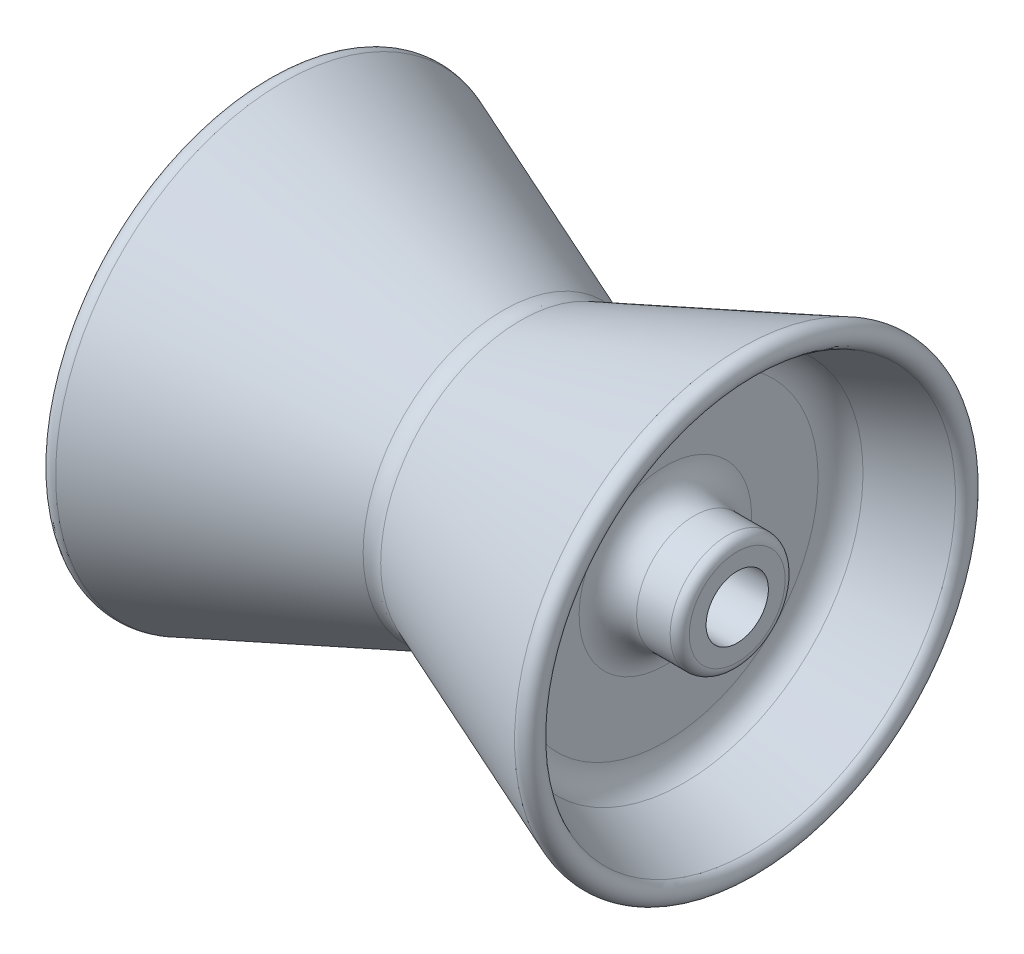
ISO-10303-21;
HEADER;
FILE_DESCRIPTION(('STEP AP214'),'2;1');
FILE_NAME('part.step','',(''),(''),'','','');
FILE_SCHEMA(('AUTOMOTIVE_DESIGN { 1 0 10303 214 1 1 1 1 }'));
ENDSEC;
DATA;
#1=APPLICATION_CONTEXT('core data for automotive mechanical design processes');
#2=APPLICATION_PROTOCOL_DEFINITION('international standard','automotive_design',2000,#1);
#3=PRODUCT_CONTEXT('',#1,'mechanical');
#4=PRODUCT('Part','Part','',(#3));
#5=PRODUCT_RELATED_PRODUCT_CATEGORY('part','',(#4));
#6=PRODUCT_DEFINITION_FORMATION('','',#4);
#7=PRODUCT_DEFINITION_CONTEXT('part definition',#1,'design');
#8=PRODUCT_DEFINITION('design','',#6,#7);
#9=PRODUCT_DEFINITION_SHAPE('','',#8);
#10=(LENGTH_UNIT() NAMED_UNIT(*) SI_UNIT(.MILLI.,.METRE.));
#11=(NAMED_UNIT(*) PLANE_ANGLE_UNIT() SI_UNIT($,.RADIAN.));
#12=(NAMED_UNIT(*) SI_UNIT($,.STERADIAN.) SOLID_ANGLE_UNIT());
#13=UNCERTAINTY_MEASURE_WITH_UNIT(LENGTH_MEASURE(1.E-05),#10,'distance_accuracy_value','');
#14=(GEOMETRIC_REPRESENTATION_CONTEXT(3) GLOBAL_UNCERTAINTY_ASSIGNED_CONTEXT((#13)) GLOBAL_UNIT_ASSIGNED_CONTEXT((#10,
#11,#12)) REPRESENTATION_CONTEXT('',''));
#15=CARTESIAN_POINT('',(0.,0.,0.));
#16=DIRECTION('',(0.,0.,1.));
#17=DIRECTION('',(1.,0.,0.));
#18=AXIS2_PLACEMENT_3D('',#15,#16,#17);
#19=CARTESIAN_POINT('',(239.439905947278,0.,0.));
#20=DIRECTION('',(1.,0.,0.));
#21=DIRECTION('',(0.,1.,0.));
#22=AXIS2_PLACEMENT_3D('',#19,#20,#21);
#23=CONICAL_SURFACE('',#22,236.773734056667,0.374812801640397);
#24=CARTESIAN_POINT('',(9.152458329224,0.,0.));
#25=DIRECTION('',(-1.,0.,0.));
#26=DIRECTION('',(0.,-1.,0.));
#27=AXIS2_PLACEMENT_3D('',#24,#25,#26);
#28=CIRCLE('',#27,146.176259793207);
#29=CARTESIAN_POINT('',(9.152458329224,-146.176259793207,0.));
#30=VERTEX_POINT('',#29);
#31=EDGE_CURVE('E124',#30,#30,#28,.T.);
#32=ORIENTED_EDGE('',*,*,#31,.F.);
#33=EDGE_LOOP('',(#32));
#34=FACE_BOUND('',#33,.T.);
#35=CARTESIAN_POINT('',(239.439905947278,0.,0.));
#36=DIRECTION('',(-1.,0.,0.));
#37=DIRECTION('',(0.,-1.,0.));
#38=AXIS2_PLACEMENT_3D('',#35,#36,#37);
#39=CIRCLE('',#38,236.773734056667);
#40=CARTESIAN_POINT('',(239.439905947278,-236.773734056667,0.));
#41=VERTEX_POINT('',#40);
#42=EDGE_CURVE('E121',#41,#41,#39,.T.);
#43=ORIENTED_EDGE('',*,*,#42,.T.);
#44=EDGE_LOOP('',(#43));
#45=FACE_BOUND('',#44,.T.);
#46=ADVANCED_FACE('F35',(#34,#45),#23,.T.);
#47=CARTESIAN_POINT('',(1.71737624121704E-13,0.,0.));
#48=DIRECTION('',(-1.,0.,0.));
#49=DIRECTION('',(0.,-1.,0.));
#50=AXIS2_PLACEMENT_3D('',#47,#48,#49);
#51=TOROIDAL_SURFACE('',#50,169.440664073821,25.000000000001);
#52=ORIENTED_EDGE('',*,*,#31,.T.);
#53=EDGE_LOOP('',(#52));
#54=FACE_BOUND('',#53,.T.);
#55=CARTESIAN_POINT('',(-9.15245832922424,0.,0.));
#56=DIRECTION('',(-1.,0.,0.));
#57=DIRECTION('',(0.,-1.,0.));
#58=AXIS2_PLACEMENT_3D('',#55,#56,#57);
#59=CIRCLE('',#58,146.176259793206);
#60=CARTESIAN_POINT('',(-9.15245832922424,-146.176259793206,0.));
#61=VERTEX_POINT('',#60);
#62=EDGE_CURVE('E10',#61,#61,#59,.T.);
#63=ORIENTED_EDGE('',*,*,#62,.F.);
#64=EDGE_LOOP('',(#63));
#65=FACE_BOUND('',#64,.T.);
#66=ADVANCED_FACE('F37',(#54,#65),#51,.F.);
#67=CARTESIAN_POINT('',(243.833085945306,0.,0.));
#68=DIRECTION('',(-1.,0.,0.));
#69=DIRECTION('',(0.,-1.,0.));
#70=AXIS2_PLACEMENT_3D('',#67,#68,#69);
#71=TOROIDAL_SURFACE('',#70,225.606820001973,12.);
#72=ORIENTED_EDGE('',*,*,#42,.F.);
#73=EDGE_LOOP('',(#72));
#74=FACE_BOUND('',#73,.T.);
#75=CARTESIAN_POINT('',(248.226265943333,0.,0.));
#76=DIRECTION('',(-1.,0.,0.));
#77=DIRECTION('',(0.,-1.,0.));
#78=AXIS2_PLACEMENT_3D('',#75,#76,#77);
#79=CIRCLE('',#78,214.439905947278);
#80=CARTESIAN_POINT('',(248.226265943333,-214.439905947278,0.));
#81=VERTEX_POINT('',#80);
#82=EDGE_CURVE('E118',#81,#81,#79,.T.);
#83=ORIENTED_EDGE('',*,*,#82,.T.);
#84=EDGE_LOOP('',(#83));
#85=FACE_BOUND('',#84,.T.);
#86=ADVANCED_FACE('F133',(#74,#85),#71,.T.);
#87=CARTESIAN_POINT('',(248.226265943333,0.,0.));
#88=DIRECTION('',(1.,0.,0.));
#89=DIRECTION('',(0.,1.,0.));
#90=AXIS2_PLACEMENT_3D('',#87,#88,#89);
#91=CONICAL_SURFACE('',#90,214.439905947278,0.374812801640398);
#92=CARTESIAN_POINT('',(179.017050004931,0.,0.));
#93=DIRECTION('',(-1.,0.,0.));
#94=DIRECTION('',(0.,-1.,0.));
#95=AXIS2_PLACEMENT_3D('',#92,#93,#94);
#96=CIRCLE('',#95,187.212281408345);
#97=CARTESIAN_POINT('',(179.017050004931,-187.212281408345,0.));
#98=VERTEX_POINT('',#97);
#99=EDGE_CURVE('E115',#98,#98,#96,.T.);
#100=ORIENTED_EDGE('',*,*,#99,.T.);
#101=EDGE_LOOP('',(#100));
#102=FACE_BOUND('',#101,.T.);
#103=ORIENTED_EDGE('',*,*,#82,.F.);
#104=EDGE_LOOP('',(#103));
#105=FACE_BOUND('',#104,.T.);
#106=ADVANCED_FACE('F138',(#102,#105),#91,.F.);
#107=CARTESIAN_POINT('',(190.,0.,0.));
#108=DIRECTION('',(-1.,0.,0.));
#109=DIRECTION('',(0.,-1.,0.));
#110=AXIS2_PLACEMENT_3D('',#107,#108,#109);
#111=TOROIDAL_SURFACE('',#110,159.294996271609,30.);
#112=CARTESIAN_POINT('',(160.,0.,0.));
#113=DIRECTION('',(-1.,0.,0.));
#114=DIRECTION('',(0.,-1.,0.));
#115=AXIS2_PLACEMENT_3D('',#112,#113,#114);
#116=CIRCLE('',#115,159.294996271609);
#117=CARTESIAN_POINT('',(160.,-159.294996271609,0.));
#118=VERTEX_POINT('',#117);
#119=EDGE_CURVE('E112',#118,#118,#116,.T.);
#120=ORIENTED_EDGE('',*,*,#119,.T.);
#121=EDGE_LOOP('',(#120));
#122=FACE_BOUND('',#121,.T.);
#123=ORIENTED_EDGE('',*,*,#99,.F.);
#124=EDGE_LOOP('',(#123));
#125=FACE_BOUND('',#124,.T.);
#126=ADVANCED_FACE('F143',(#122,#125),#111,.F.);
#127=CARTESIAN_POINT('',(160.,0.,0.));
#128=DIRECTION('',(-1.,0.,0.));
#129=DIRECTION('',(0.,-1.,0.));
#130=AXIS2_PLACEMENT_3D('',#127,#128,#129);
#131=PLANE('',#130);
#132=ORIENTED_EDGE('',*,*,#119,.F.);
#133=EDGE_LOOP('',(#132));
#134=FACE_BOUND('',#133,.T.);
#135=CARTESIAN_POINT('',(160.,0.,0.));
#136=DIRECTION('',(-1.,0.,0.));
#137=DIRECTION('',(0.,-1.,0.));
#138=AXIS2_PLACEMENT_3D('',#135,#136,#137);
#139=CIRCLE('',#138,90.);
#140=CARTESIAN_POINT('',(160.,-90.,0.));
#141=VERTEX_POINT('',#140);
#142=EDGE_CURVE('E109',#141,#141,#139,.T.);
#143=ORIENTED_EDGE('',*,*,#142,.T.);
#144=EDGE_LOOP('',(#143));
#145=FACE_BOUND('',#144,.T.);
#146=ADVANCED_FACE('F149',(#134,#145),#131,.F.);
#147=CARTESIAN_POINT('',(190.,0.,0.));
#148=DIRECTION('',(-1.,0.,0.));
#149=DIRECTION('',(0.,-1.,0.));
#150=AXIS2_PLACEMENT_3D('',#147,#148,#149);
#151=TOROIDAL_SURFACE('',#150,90.,30.);
#152=CARTESIAN_POINT('',(190.,0.,0.));
#153=DIRECTION('',(-1.,0.,0.));
#154=DIRECTION('',(0.,-1.,0.));
#155=AXIS2_PLACEMENT_3D('',#152,#153,#154);
#156=CIRCLE('',#155,60.);
#157=CARTESIAN_POINT('',(190.,-60.,0.));
#158=VERTEX_POINT('',#157);
#159=EDGE_CURVE('E106',#158,#158,#156,.T.);
#160=ORIENTED_EDGE('',*,*,#159,.T.);
#161=EDGE_LOOP('',(#160));
#162=FACE_BOUND('',#161,.T.);
#163=ORIENTED_EDGE('',*,*,#142,.F.);
#164=EDGE_LOOP('',(#163));
#165=FACE_BOUND('',#164,.T.);
#166=ADVANCED_FACE('F184',(#162,#165),#151,.F.);
#167=CARTESIAN_POINT('',(-0.0308439148893081,0.,0.));
#168=DIRECTION('',(-1.,0.,0.));
#169=DIRECTION('',(0.,-1.,0.));
#170=AXIS2_PLACEMENT_3D('',#167,#168,#169);
#171=CYLINDRICAL_SURFACE('',#170,60.);
#172=CARTESIAN_POINT('',(225.,0.,0.));
#173=DIRECTION('',(-1.,0.,0.));
#174=DIRECTION('',(0.,-1.,0.));
#175=AXIS2_PLACEMENT_3D('',#172,#173,#174);
#176=CIRCLE('',#175,60.);
#177=CARTESIAN_POINT('',(225.,-60.,0.));
#178=VERTEX_POINT('',#177);
#179=EDGE_CURVE('E103',#178,#178,#176,.T.);
#180=ORIENTED_EDGE('',*,*,#179,.T.);
#181=EDGE_LOOP('',(#180));
#182=FACE_BOUND('',#181,.T.);
#183=ORIENTED_EDGE('',*,*,#159,.F.);
#184=EDGE_LOOP('',(#183));
#185=FACE_BOUND('',#184,.T.);
#186=ADVANCED_FACE('F195',(#182,#185),#171,.T.);
#187=CARTESIAN_POINT('',(225.,0.,0.));
#188=DIRECTION('',(-1.,0.,0.));
#189=DIRECTION('',(0.,-1.,0.));
#190=AXIS2_PLACEMENT_3D('',#187,#188,#189);
#191=TOROIDAL_SURFACE('',#190,50.,10.);
#192=CARTESIAN_POINT('',(235.,0.,0.));
#193=DIRECTION('',(-1.,0.,0.));
#194=DIRECTION('',(0.,-1.,0.));
#195=AXIS2_PLACEMENT_3D('',#192,#193,#194);
#196=CIRCLE('',#195,49.9999999999999);
#197=CARTESIAN_POINT('',(235.,-49.9999999999999,0.));
#198=VERTEX_POINT('',#197);
#199=EDGE_CURVE('E100',#198,#198,#196,.T.);
#200=ORIENTED_EDGE('',*,*,#199,.T.);
#201=EDGE_LOOP('',(#200));
#202=FACE_BOUND('',#201,.T.);
#203=ORIENTED_EDGE('',*,*,#179,.F.);
#204=EDGE_LOOP('',(#203));
#205=FACE_BOUND('',#204,.T.);
#206=ADVANCED_FACE('F206',(#202,#205),#191,.T.);
#207=CARTESIAN_POINT('',(235.,3.72717729695589E-13,0.));
#208=DIRECTION('',(1.,0.,0.));
#209=DIRECTION('',(0.,1.,0.));
#210=AXIS2_PLACEMENT_3D('',#207,#208,#209);
#211=PLANE('',#210);
#212=CARTESIAN_POINT('',(235.,0.,0.));
#213=DIRECTION('',(-1.,0.,0.));
#214=DIRECTION('',(0.,-1.,0.));
#215=AXIS2_PLACEMENT_3D('',#212,#213,#214);
#216=CIRCLE('',#215,32.5);
#217=CARTESIAN_POINT('',(235.,-32.5,0.));
#218=VERTEX_POINT('',#217);
#219=EDGE_CURVE('E97',#218,#218,#216,.T.);
#220=ORIENTED_EDGE('',*,*,#219,.T.);
#221=EDGE_LOOP('',(#220));
#222=FACE_BOUND('',#221,.T.);
#223=ORIENTED_EDGE('',*,*,#199,.F.);
#224=EDGE_LOOP('',(#223));
#225=FACE_BOUND('',#224,.T.);
#226=ADVANCED_FACE('F217',(#222,#225),#211,.T.);
#227=CARTESIAN_POINT('',(-0.0308439148893081,0.,0.));
#228=DIRECTION('',(-1.,0.,0.));
#229=DIRECTION('',(0.,-1.,0.));
#230=AXIS2_PLACEMENT_3D('',#227,#228,#229);
#231=CYLINDRICAL_SURFACE('',#230,32.5);
#232=ORIENTED_EDGE('',*,*,#219,.F.);
#233=EDGE_LOOP('',(#232));
#234=FACE_BOUND('',#233,.T.);
#235=CARTESIAN_POINT('',(130.,0.,0.));
#236=DIRECTION('',(-1.,0.,0.));
#237=DIRECTION('',(0.,-1.,0.));
#238=AXIS2_PLACEMENT_3D('',#235,#236,#237);
#239=CIRCLE('',#238,32.5);
#240=CARTESIAN_POINT('',(130.,-32.5,0.));
#241=VERTEX_POINT('',#240);
#242=EDGE_CURVE('E94',#241,#241,#239,.T.);
#243=ORIENTED_EDGE('',*,*,#242,.T.);
#244=EDGE_LOOP('',(#243));
#245=FACE_BOUND('',#244,.T.);
#246=ADVANCED_FACE('F228',(#234,#245),#231,.F.);
#247=CARTESIAN_POINT('',(130.,0.,0.));
#248=DIRECTION('',(1.,0.,0.));
#249=DIRECTION('',(0.,1.,0.));
#250=AXIS2_PLACEMENT_3D('',#247,#248,#249);
#251=PLANE('',#250);
#252=ORIENTED_EDGE('',*,*,#242,.F.);
#253=EDGE_LOOP('',(#252));
#254=FACE_BOUND('',#253,.T.);
#255=CARTESIAN_POINT('',(130.,0.,0.));
#256=DIRECTION('',(-1.,0.,0.));
#257=DIRECTION('',(0.,-1.,0.));
#258=AXIS2_PLACEMENT_3D('',#255,#256,#257);
#259=CIRCLE('',#258,121.016615460267);
#260=CARTESIAN_POINT('',(130.,-121.016615460267,0.));
#261=VERTEX_POINT('',#260);
#262=EDGE_CURVE('E91',#261,#261,#259,.T.);
#263=ORIENTED_EDGE('',*,*,#262,.T.);
#264=EDGE_LOOP('',(#263));
#265=FACE_BOUND('',#264,.T.);
#266=ADVANCED_FACE('F239',(#254,#265),#251,.F.);
#267=CARTESIAN_POINT('',(100.,0.,0.));
#268=DIRECTION('',(-1.,0.,0.));
#269=DIRECTION('',(0.,-1.,0.));
#270=AXIS2_PLACEMENT_3D('',#267,#268,#269);
#271=TOROIDAL_SURFACE('',#270,121.016615460267,30.);
#272=CARTESIAN_POINT('',(90.9673582353727,0.,0.));
#273=DIRECTION('',(-1.,0.,0.));
#274=DIRECTION('',(0.,-1.,0.));
#275=AXIS2_PLACEMENT_3D('',#272,#273,#274);
#276=CIRCLE('',#275,149.624505678735);
#277=CARTESIAN_POINT('',(90.9673582353727,-149.624505678735,0.));
#278=VERTEX_POINT('',#277);
#279=EDGE_CURVE('E88',#278,#278,#276,.T.);
#280=ORIENTED_EDGE('',*,*,#279,.T.);
#281=EDGE_LOOP('',(#280));
#282=FACE_BOUND('',#281,.T.);
#283=ORIENTED_EDGE('',*,*,#262,.F.);
#284=EDGE_LOOP('',(#283));
#285=FACE_BOUND('',#284,.T.);
#286=ADVANCED_FACE('F250',(#282,#285),#271,.F.);
#287=CARTESIAN_POINT('',(90.9673582353727,0.,0.));
#288=DIRECTION('',(1.,0.,0.));
#289=DIRECTION('',(0.,1.,0.));
#290=AXIS2_PLACEMENT_3D('',#287,#288,#289);
#291=CONICAL_SURFACE('',#290,149.624505678735,0.305833454465961);
#292=CARTESIAN_POINT('',(15.0544029410455,0.,0.));
#293=DIRECTION('',(-1.,0.,0.));
#294=DIRECTION('',(0.,-1.,0.));
#295=AXIS2_PLACEMENT_3D('',#292,#293,#294);
#296=CIRCLE('',#295,125.655784978556);
#297=CARTESIAN_POINT('',(15.0544029410455,-125.655784978556,0.));
#298=VERTEX_POINT('',#297);
#299=EDGE_CURVE('E85',#298,#298,#296,.T.);
#300=ORIENTED_EDGE('',*,*,#299,.T.);
#301=EDGE_LOOP('',(#300));
#302=FACE_BOUND('',#301,.T.);
#303=ORIENTED_EDGE('',*,*,#279,.F.);
#304=EDGE_LOOP('',(#303));
#305=FACE_BOUND('',#304,.T.);
#306=ADVANCED_FACE('F261',(#302,#305),#291,.F.);
#307=CARTESIAN_POINT('',(0.,0.,0.));
#308=DIRECTION('',(-1.,0.,0.));
#309=DIRECTION('',(0.,-1.,0.));
#310=AXIS2_PLACEMENT_3D('',#307,#308,#309);
#311=TOROIDAL_SURFACE('',#310,173.335602009336,50.);
#312=ORIENTED_EDGE('',*,*,#299,.F.);
#313=EDGE_LOOP('',(#312));
#314=FACE_BOUND('',#313,.T.);
#315=CARTESIAN_POINT('',(-15.0544029410455,0.,0.));
#316=DIRECTION('',(-1.,0.,0.));
#317=DIRECTION('',(0.,-1.,0.));
#318=AXIS2_PLACEMENT_3D('',#315,#316,#317);
#319=CIRCLE('',#318,125.655784978556);
#320=CARTESIAN_POINT('',(-15.0544029410455,-125.655784978556,0.));
#321=VERTEX_POINT('',#320);
#322=EDGE_CURVE('E82',#321,#321,#319,.T.);
#323=ORIENTED_EDGE('',*,*,#322,.T.);
#324=EDGE_LOOP('',(#323));
#325=FACE_BOUND('',#324,.T.);
#326=ADVANCED_FACE('F272',(#314,#325),#311,.T.);
#327=CARTESIAN_POINT('',(-90.9673582353727,0.,0.));
#328=DIRECTION('',(-1.,0.,0.));
#329=DIRECTION('',(0.,-1.,0.));
#330=AXIS2_PLACEMENT_3D('',#327,#328,#329);
#331=CONICAL_SURFACE('',#330,149.624505678735,0.305833454465961);
#332=ORIENTED_EDGE('',*,*,#322,.F.);
#333=EDGE_LOOP('',(#332));
#334=FACE_BOUND('',#333,.T.);
#335=CARTESIAN_POINT('',(-90.9673582353727,0.,0.));
#336=DIRECTION('',(-1.,0.,0.));
#337=DIRECTION('',(0.,-1.,0.));
#338=AXIS2_PLACEMENT_3D('',#335,#336,#337);
#339=CIRCLE('',#338,149.624505678735);
#340=CARTESIAN_POINT('',(-90.9673582353727,-149.624505678735,0.));
#341=VERTEX_POINT('',#340);
#342=EDGE_CURVE('E79',#341,#341,#339,.T.);
#343=ORIENTED_EDGE('',*,*,#342,.T.);
#344=EDGE_LOOP('',(#343));
#345=FACE_BOUND('',#344,.T.);
#346=ADVANCED_FACE('F283',(#334,#345),#331,.F.);
#347=CARTESIAN_POINT('',(-100.,0.,0.));
#348=DIRECTION('',(-1.,0.,0.));
#349=DIRECTION('',(0.,-1.,0.));
#350=AXIS2_PLACEMENT_3D('',#347,#348,#349);
#351=TOROIDAL_SURFACE('',#350,121.016615460267,30.);
#352=ORIENTED_EDGE('',*,*,#342,.F.);
#353=EDGE_LOOP('',(#352));
#354=FACE_BOUND('',#353,.T.);
#355=CARTESIAN_POINT('',(-130.,0.,0.));
#356=DIRECTION('',(-1.,0.,0.));
#357=DIRECTION('',(0.,-1.,0.));
#358=AXIS2_PLACEMENT_3D('',#355,#356,#357);
#359=CIRCLE('',#358,121.016615460267);
#360=CARTESIAN_POINT('',(-130.,-121.016615460267,0.));
#361=VERTEX_POINT('',#360);
#362=EDGE_CURVE('E76',#361,#361,#359,.T.);
#363=ORIENTED_EDGE('',*,*,#362,.T.);
#364=EDGE_LOOP('',(#363));
#365=FACE_BOUND('',#364,.T.);
#366=ADVANCED_FACE('F294',(#354,#365),#351,.F.);
#367=CARTESIAN_POINT('',(-130.,0.,0.));
#368=DIRECTION('',(1.,0.,0.));
#369=DIRECTION('',(0.,1.,0.));
#370=AXIS2_PLACEMENT_3D('',#367,#368,#369);
#371=PLANE('',#370);
#372=CARTESIAN_POINT('',(-130.,0.,0.));
#373=DIRECTION('',(-1.,0.,0.));
#374=DIRECTION('',(0.,-1.,0.));
#375=AXIS2_PLACEMENT_3D('',#372,#373,#374);
#376=CIRCLE('',#375,32.5);
#377=CARTESIAN_POINT('',(-130.,-32.5,0.));
#378=VERTEX_POINT('',#377);
#379=EDGE_CURVE('E73',#378,#378,#376,.T.);
#380=ORIENTED_EDGE('',*,*,#379,.T.);
#381=EDGE_LOOP('',(#380));
#382=FACE_BOUND('',#381,.T.);
#383=ORIENTED_EDGE('',*,*,#362,.F.);
#384=EDGE_LOOP('',(#383));
#385=FACE_BOUND('',#384,.T.);
#386=ADVANCED_FACE('F305',(#382,#385),#371,.T.);
#387=CARTESIAN_POINT('',(-0.0308439148893081,0.,0.));
#388=DIRECTION('',(-1.,0.,0.));
#389=DIRECTION('',(0.,-1.,0.));
#390=AXIS2_PLACEMENT_3D('',#387,#388,#389);
#391=CYLINDRICAL_SURFACE('',#390,32.5);
#392=CARTESIAN_POINT('',(-235.,0.,0.));
#393=DIRECTION('',(-1.,0.,0.));
#394=DIRECTION('',(0.,-1.,0.));
#395=AXIS2_PLACEMENT_3D('',#392,#393,#394);
#396=CIRCLE('',#395,32.5);
#397=CARTESIAN_POINT('',(-235.,-32.5,0.));
#398=VERTEX_POINT('',#397);
#399=EDGE_CURVE('E70',#398,#398,#396,.T.);
#400=ORIENTED_EDGE('',*,*,#399,.T.);
#401=EDGE_LOOP('',(#400));
#402=FACE_BOUND('',#401,.T.);
#403=ORIENTED_EDGE('',*,*,#379,.F.);
#404=EDGE_LOOP('',(#403));
#405=FACE_BOUND('',#404,.T.);
#406=ADVANCED_FACE('F316',(#402,#405),#391,.F.);
#407=CARTESIAN_POINT('',(-235.,3.72717729695589E-13,0.));
#408=DIRECTION('',(1.,0.,0.));
#409=DIRECTION('',(0.,1.,0.));
#410=AXIS2_PLACEMENT_3D('',#407,#408,#409);
#411=PLANE('',#410);
#412=ORIENTED_EDGE('',*,*,#399,.F.);
#413=EDGE_LOOP('',(#412));
#414=FACE_BOUND('',#413,.T.);
#415=CARTESIAN_POINT('',(-235.,0.,0.));
#416=DIRECTION('',(-1.,0.,0.));
#417=DIRECTION('',(0.,-1.,0.));
#418=AXIS2_PLACEMENT_3D('',#415,#416,#417);
#419=CIRCLE('',#418,49.9999999999999);
#420=CARTESIAN_POINT('',(-235.,-49.9999999999999,0.));
#421=VERTEX_POINT('',#420);
#422=EDGE_CURVE('E67',#421,#421,#419,.T.);
#423=ORIENTED_EDGE('',*,*,#422,.T.);
#424=EDGE_LOOP('',(#423));
#425=FACE_BOUND('',#424,.T.);
#426=ADVANCED_FACE('F327',(#414,#425),#411,.F.);
#427=CARTESIAN_POINT('',(-225.,0.,0.));
#428=DIRECTION('',(-1.,0.,0.));
#429=DIRECTION('',(0.,-1.,0.));
#430=AXIS2_PLACEMENT_3D('',#427,#428,#429);
#431=TOROIDAL_SURFACE('',#430,50.,10.);
#432=ORIENTED_EDGE('',*,*,#422,.F.);
#433=EDGE_LOOP('',(#432));
#434=FACE_BOUND('',#433,.T.);
#435=CARTESIAN_POINT('',(-225.,0.,0.));
#436=DIRECTION('',(-1.,0.,0.));
#437=DIRECTION('',(0.,-1.,0.));
#438=AXIS2_PLACEMENT_3D('',#435,#436,#437);
#439=CIRCLE('',#438,60.);
#440=CARTESIAN_POINT('',(-225.,-60.,0.));
#441=VERTEX_POINT('',#440);
#442=EDGE_CURVE('E64',#441,#441,#439,.T.);
#443=ORIENTED_EDGE('',*,*,#442,.T.);
#444=EDGE_LOOP('',(#443));
#445=FACE_BOUND('',#444,.T.);
#446=ADVANCED_FACE('F338',(#434,#445),#431,.T.);
#447=CARTESIAN_POINT('',(-0.0308439148893081,0.,0.));
#448=DIRECTION('',(-1.,0.,0.));
#449=DIRECTION('',(0.,-1.,0.));
#450=AXIS2_PLACEMENT_3D('',#447,#448,#449);
#451=CYLINDRICAL_SURFACE('',#450,60.);
#452=ORIENTED_EDGE('',*,*,#442,.F.);
#453=EDGE_LOOP('',(#452));
#454=FACE_BOUND('',#453,.T.);
#455=CARTESIAN_POINT('',(-190.,0.,0.));
#456=DIRECTION('',(-1.,0.,0.));
#457=DIRECTION('',(0.,-1.,0.));
#458=AXIS2_PLACEMENT_3D('',#455,#456,#457);
#459=CIRCLE('',#458,60.);
#460=CARTESIAN_POINT('',(-190.,-60.,0.));
#461=VERTEX_POINT('',#460);
#462=EDGE_CURVE('E61',#461,#461,#459,.T.);
#463=ORIENTED_EDGE('',*,*,#462,.T.);
#464=EDGE_LOOP('',(#463));
#465=FACE_BOUND('',#464,.T.);
#466=ADVANCED_FACE('F349',(#454,#465),#451,.T.);
#467=CARTESIAN_POINT('',(-190.,0.,0.));
#468=DIRECTION('',(-1.,0.,0.));
#469=DIRECTION('',(0.,-1.,0.));
#470=AXIS2_PLACEMENT_3D('',#467,#468,#469);
#471=TOROIDAL_SURFACE('',#470,90.,30.);
#472=ORIENTED_EDGE('',*,*,#462,.F.);
#473=EDGE_LOOP('',(#472));
#474=FACE_BOUND('',#473,.T.);
#475=CARTESIAN_POINT('',(-160.,0.,0.));
#476=DIRECTION('',(-1.,0.,0.));
#477=DIRECTION('',(0.,-1.,0.));
#478=AXIS2_PLACEMENT_3D('',#475,#476,#477);
#479=CIRCLE('',#478,90.);
#480=CARTESIAN_POINT('',(-160.,-90.,0.));
#481=VERTEX_POINT('',#480);
#482=EDGE_CURVE('E58',#481,#481,#479,.T.);
#483=ORIENTED_EDGE('',*,*,#482,.T.);
#484=EDGE_LOOP('',(#483));
#485=FACE_BOUND('',#484,.T.);
#486=ADVANCED_FACE('F360',(#474,#485),#471,.F.);
#487=CARTESIAN_POINT('',(-160.,0.,0.));
#488=DIRECTION('',(-1.,0.,0.));
#489=DIRECTION('',(0.,-1.,0.));
#490=AXIS2_PLACEMENT_3D('',#487,#488,#489);
#491=PLANE('',#490);
#492=CARTESIAN_POINT('',(-160.,0.,0.));
#493=DIRECTION('',(-1.,0.,0.));
#494=DIRECTION('',(0.,-1.,0.));
#495=AXIS2_PLACEMENT_3D('',#492,#493,#494);
#496=CIRCLE('',#495,159.294996271609);
#497=CARTESIAN_POINT('',(-160.,-159.294996271609,0.));
#498=VERTEX_POINT('',#497);
#499=EDGE_CURVE('E55',#498,#498,#496,.T.);
#500=ORIENTED_EDGE('',*,*,#499,.T.);
#501=EDGE_LOOP('',(#500));
#502=FACE_BOUND('',#501,.T.);
#503=ORIENTED_EDGE('',*,*,#482,.F.);
#504=EDGE_LOOP('',(#503));
#505=FACE_BOUND('',#504,.T.);
#506=ADVANCED_FACE('F371',(#502,#505),#491,.T.);
#507=CARTESIAN_POINT('',(-190.,0.,0.));
#508=DIRECTION('',(-1.,0.,0.));
#509=DIRECTION('',(0.,-1.,0.));
#510=AXIS2_PLACEMENT_3D('',#507,#508,#509);
#511=TOROIDAL_SURFACE('',#510,159.294996271609,29.9999999999998);
#512=ORIENTED_EDGE('',*,*,#499,.F.);
#513=EDGE_LOOP('',(#512));
#514=FACE_BOUND('',#513,.T.);
#515=CARTESIAN_POINT('',(-179.017050004931,0.,0.));
#516=DIRECTION('',(-1.,0.,0.));
#517=DIRECTION('',(0.,-1.,0.));
#518=AXIS2_PLACEMENT_3D('',#515,#516,#517);
#519=CIRCLE('',#518,187.212281408345);
#520=CARTESIAN_POINT('',(-179.017050004931,-187.212281408345,0.));
#521=VERTEX_POINT('',#520);
#522=EDGE_CURVE('E50',#521,#521,#519,.T.);
#523=ORIENTED_EDGE('',*,*,#522,.T.);
#524=EDGE_LOOP('',(#523));
#525=FACE_BOUND('',#524,.T.);
#526=ADVANCED_FACE('F382',(#514,#525),#511,.F.);
#527=CARTESIAN_POINT('',(-248.226265943333,0.,0.));
#528=DIRECTION('',(-1.,0.,0.));
#529=DIRECTION('',(0.,-1.,0.));
#530=AXIS2_PLACEMENT_3D('',#527,#528,#529);
#531=CONICAL_SURFACE('',#530,214.439905947278,0.374812801640402);
#532=ORIENTED_EDGE('',*,*,#522,.F.);
#533=EDGE_LOOP('',(#532));
#534=FACE_BOUND('',#533,.T.);
#535=CARTESIAN_POINT('',(-248.226265943333,0.,0.));
#536=DIRECTION('',(-1.,0.,0.));
#537=DIRECTION('',(0.,-1.,0.));
#538=AXIS2_PLACEMENT_3D('',#535,#536,#537);
#539=CIRCLE('',#538,214.439905947278);
#540=CARTESIAN_POINT('',(-248.226265943333,-214.439905947278,0.));
#541=VERTEX_POINT('',#540);
#542=EDGE_CURVE('E46',#541,#541,#539,.T.);
#543=ORIENTED_EDGE('',*,*,#542,.T.);
#544=EDGE_LOOP('',(#543));
#545=FACE_BOUND('',#544,.T.);
#546=ADVANCED_FACE('F393',(#534,#545),#531,.F.);
#547=CARTESIAN_POINT('',(-243.833085945306,0.,0.));
#548=DIRECTION('',(-1.,0.,0.));
#549=DIRECTION('',(0.,-1.,0.));
#550=AXIS2_PLACEMENT_3D('',#547,#548,#549);
#551=TOROIDAL_SURFACE('',#550,225.606820001972,12.);
#552=CARTESIAN_POINT('',(-239.439905947278,0.,0.));
#553=DIRECTION('',(-1.,0.,0.));
#554=DIRECTION('',(0.,-1.,0.));
#555=AXIS2_PLACEMENT_3D('',#552,#553,#554);
#556=CIRCLE('',#555,236.773734056667);
#557=CARTESIAN_POINT('',(-239.439905947278,-236.773734056667,0.));
#558=VERTEX_POINT('',#557);
#559=EDGE_CURVE('E42',#558,#558,#556,.T.);
#560=ORIENTED_EDGE('',*,*,#559,.T.);
#561=EDGE_LOOP('',(#560));
#562=FACE_BOUND('',#561,.T.);
#563=ORIENTED_EDGE('',*,*,#542,.F.);
#564=EDGE_LOOP('',(#563));
#565=FACE_BOUND('',#564,.T.);
#566=ADVANCED_FACE('F404',(#562,#565),#551,.T.);
#567=CARTESIAN_POINT('',(-239.439905947278,0.,0.));
#568=DIRECTION('',(-1.,0.,0.));
#569=DIRECTION('',(0.,-1.,0.));
#570=AXIS2_PLACEMENT_3D('',#567,#568,#569);
#571=CONICAL_SURFACE('',#570,236.773734056667,0.374812801640401);
#572=ORIENTED_EDGE('',*,*,#62,.T.);
#573=EDGE_LOOP('',(#572));
#574=FACE_BOUND('',#573,.T.);
#575=ORIENTED_EDGE('',*,*,#559,.F.);
#576=EDGE_LOOP('',(#575));
#577=FACE_BOUND('',#576,.T.);
#578=ADVANCED_FACE('F415',(#574,#577),#571,.T.);
#579=CLOSED_SHELL('',(#46,#66,#86,#106,#126,#146,#166,#186,#206,#226,#246,#266,#286,#306,#326,
#346,#366,#386,#406,#426,#446,#466,#486,#506,#526,#546,#566,#578));
#580=MANIFOLD_SOLID_BREP('B2',#579);
#581=ADVANCED_BREP_SHAPE_REPRESENTATION('',(#18,#580),#14);
#582=SHAPE_DEFINITION_REPRESENTATION(#9,#581);
ENDSEC;
END-ISO-10303-21;
